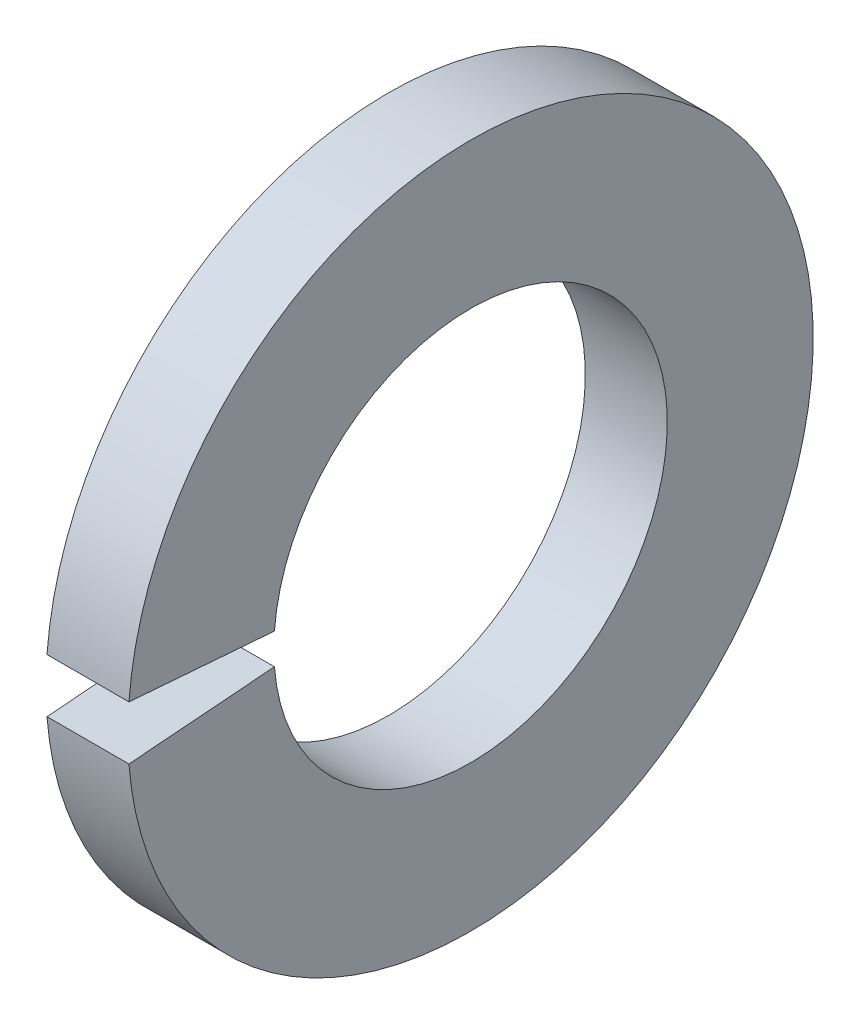
ISO-10303-21;
HEADER;
FILE_DESCRIPTION(('STEP AP214'),'2;1');
FILE_NAME('part.step','',(''),(''),'','','');
FILE_SCHEMA(('AUTOMOTIVE_DESIGN { 1 0 10303 214 1 1 1 1 }'));
ENDSEC;
DATA;
#1=APPLICATION_CONTEXT('core data for automotive mechanical design processes');
#2=APPLICATION_PROTOCOL_DEFINITION('international standard','automotive_design',2000,#1);
#3=PRODUCT_CONTEXT('',#1,'mechanical');
#4=PRODUCT('Part','Part','',(#3));
#5=PRODUCT_RELATED_PRODUCT_CATEGORY('part','',(#4));
#6=PRODUCT_DEFINITION_FORMATION('','',#4);
#7=PRODUCT_DEFINITION_CONTEXT('part definition',#1,'design');
#8=PRODUCT_DEFINITION('design','',#6,#7);
#9=PRODUCT_DEFINITION_SHAPE('','',#8);
#10=(LENGTH_UNIT() NAMED_UNIT(*) SI_UNIT(.MILLI.,.METRE.));
#11=(NAMED_UNIT(*) PLANE_ANGLE_UNIT() SI_UNIT($,.RADIAN.));
#12=(NAMED_UNIT(*) SI_UNIT($,.STERADIAN.) SOLID_ANGLE_UNIT());
#13=UNCERTAINTY_MEASURE_WITH_UNIT(LENGTH_MEASURE(1.E-05),#10,'distance_accuracy_value','');
#14=(GEOMETRIC_REPRESENTATION_CONTEXT(3) GLOBAL_UNCERTAINTY_ASSIGNED_CONTEXT((#13)) GLOBAL_UNIT_ASSIGNED_CONTEXT((#10,
#11,#12)) REPRESENTATION_CONTEXT('',''));
#15=CARTESIAN_POINT('',(0.,0.,0.));
#16=DIRECTION('',(0.,0.,1.));
#17=DIRECTION('',(1.,0.,0.));
#18=AXIS2_PLACEMENT_3D('',#15,#16,#17);
#19=CARTESIAN_POINT('',(-34.9249999999999,0.,0.));
#20=DIRECTION('',(-1.,0.,0.));
#21=DIRECTION('',(0.,0.,1.));
#22=AXIS2_PLACEMENT_3D('',#19,#20,#21);
#23=CYLINDRICAL_SURFACE('',#22,1.524);
#24=CARTESIAN_POINT('',(0.,0.,0.));
#25=DIRECTION('',(-1.,0.,0.));
#26=DIRECTION('',(0.,0.,1.));
#27=AXIS2_PLACEMENT_3D('',#24,#25,#26);
#28=CIRCLE('',#27,1.524);
#29=CARTESIAN_POINT('',(0.,0.119571661889237,1.51930201660929));
#30=VERTEX_POINT('',#29);
#31=CARTESIAN_POINT('',(0.,-0.119571661889237,1.51930201660929));
#32=VERTEX_POINT('',#31);
#33=EDGE_CURVE('E83',#30,#32,#28,.T.);
#34=ORIENTED_EDGE('',*,*,#33,.F.);
#35=DIRECTION('',(-1.,0.,0.));
#36=VECTOR('',#35,1.);
#37=CARTESIAN_POINT('',(-34.9249999999999,0.119571661889237,1.51930201660929));
#38=LINE('',#37,#36);
#39=CARTESIAN_POINT('',(-0.635,0.119571661889237,1.51930201660929));
#40=VERTEX_POINT('',#39);
#41=EDGE_CURVE('E97',#30,#40,#38,.T.);
#42=ORIENTED_EDGE('',*,*,#41,.T.);
#43=CARTESIAN_POINT('',(-0.634999999999997,0.,0.));
#44=DIRECTION('',(-1.,0.,0.));
#45=DIRECTION('',(0.,0.,1.));
#46=AXIS2_PLACEMENT_3D('',#43,#44,#45);
#47=CIRCLE('',#46,1.524);
#48=CARTESIAN_POINT('',(-0.634999999999997,-0.119571661889237,1.51930201660929));
#49=VERTEX_POINT('',#48);
#50=EDGE_CURVE('E85',#40,#49,#47,.T.);
#51=ORIENTED_EDGE('',*,*,#50,.T.);
#52=DIRECTION('',(-1.,0.,0.));
#53=VECTOR('',#52,1.);
#54=CARTESIAN_POINT('',(-34.9249999999999,-0.119571661889237,1.51930201660929));
#55=LINE('',#54,#53);
#56=EDGE_CURVE('E53',#32,#49,#55,.T.);
#57=ORIENTED_EDGE('',*,*,#56,.F.);
#58=EDGE_LOOP('',(#34,#42,#51,#57));
#59=FACE_BOUND('',#58,.T.);
#60=ADVANCED_FACE('F32',(#59),#23,.F.);
#61=CARTESIAN_POINT('',(0.,1.524,0.));
#62=DIRECTION('',(-1.,0.,0.));
#63=DIRECTION('',(0.,0.,1.));
#64=AXIS2_PLACEMENT_3D('',#61,#62,#63);
#65=PLANE('',#64);
#66=CARTESIAN_POINT('',(0.,0.,0.));
#67=DIRECTION('',(-1.,0.,0.));
#68=DIRECTION('',(0.,0.,1.));
#69=AXIS2_PLACEMENT_3D('',#66,#67,#68);
#70=CIRCLE('',#69,2.6543);
#71=CARTESIAN_POINT('',(0.,0.208253977790421,2.64611767892784));
#72=VERTEX_POINT('',#71);
#73=CARTESIAN_POINT('',(0.,-0.208253977790421,2.64611767892784));
#74=VERTEX_POINT('',#73);
#75=EDGE_CURVE('E89',#72,#74,#70,.T.);
#76=ORIENTED_EDGE('',*,*,#75,.F.);
#77=DIRECTION('',(0.,0.0784590957278456,0.996917333733128));
#78=VECTOR('',#77,1.);
#79=CARTESIAN_POINT('',(0.,0.,0.));
#80=LINE('',#79,#78);
#81=EDGE_CURVE('E77',#30,#72,#80,.T.);
#82=ORIENTED_EDGE('',*,*,#81,.F.);
#83=ORIENTED_EDGE('',*,*,#33,.T.);
#84=DIRECTION('',(0.,-0.0784590957278456,0.996917333733128));
#85=VECTOR('',#84,1.);
#86=CARTESIAN_POINT('',(0.,0.,0.));
#87=LINE('',#86,#85);
#88=EDGE_CURVE('E69',#32,#74,#87,.T.);
#89=ORIENTED_EDGE('',*,*,#88,.T.);
#90=EDGE_LOOP('',(#76,#82,#83,#89));
#91=FACE_BOUND('',#90,.T.);
#92=ADVANCED_FACE('F88',(#91),#65,.F.);
#93=CARTESIAN_POINT('',(-34.9249999999999,0.,0.));
#94=DIRECTION('',(-1.,0.,0.));
#95=DIRECTION('',(0.,0.,1.));
#96=AXIS2_PLACEMENT_3D('',#93,#94,#95);
#97=CYLINDRICAL_SURFACE('',#96,2.6543);
#98=CARTESIAN_POINT('',(-0.634999999999997,0.,0.));
#99=DIRECTION('',(-1.,0.,0.));
#100=DIRECTION('',(0.,0.,1.));
#101=AXIS2_PLACEMENT_3D('',#98,#99,#100);
#102=CIRCLE('',#101,2.6543);
#103=CARTESIAN_POINT('',(-0.634999999999997,0.208253977790421,2.64611767892784));
#104=VERTEX_POINT('',#103);
#105=CARTESIAN_POINT('',(-0.635,-0.208253977790421,2.64611767892784));
#106=VERTEX_POINT('',#105);
#107=EDGE_CURVE('E91',#104,#106,#102,.T.);
#108=ORIENTED_EDGE('',*,*,#107,.F.);
#109=DIRECTION('',(-1.,0.,0.));
#110=VECTOR('',#109,1.);
#111=CARTESIAN_POINT('',(-34.9249999999999,0.208253977790421,2.64611767892784));
#112=LINE('',#111,#110);
#113=EDGE_CURVE('E46',#104,#72,#112,.F.);
#114=ORIENTED_EDGE('',*,*,#113,.T.);
#115=ORIENTED_EDGE('',*,*,#75,.T.);
#116=DIRECTION('',(-1.,0.,0.));
#117=VECTOR('',#116,1.);
#118=CARTESIAN_POINT('',(-34.9249999999999,-0.208253977790421,2.64611767892784));
#119=LINE('',#118,#117);
#120=EDGE_CURVE('E72',#106,#74,#119,.F.);
#121=ORIENTED_EDGE('',*,*,#120,.F.);
#122=EDGE_LOOP('',(#108,#114,#115,#121));
#123=FACE_BOUND('',#122,.T.);
#124=ADVANCED_FACE('F104',(#123),#97,.T.);
#125=CARTESIAN_POINT('',(-0.634999999999998,2.6543,0.));
#126=DIRECTION('',(1.,0.,0.));
#127=DIRECTION('',(0.,0.,-1.));
#128=AXIS2_PLACEMENT_3D('',#125,#126,#127);
#129=PLANE('',#128);
#130=ORIENTED_EDGE('',*,*,#50,.F.);
#131=DIRECTION('',(0.,0.0784590957278456,0.996917333733128));
#132=VECTOR('',#131,1.);
#133=CARTESIAN_POINT('',(-0.634999999999998,0.0163394187791635,0.207612000278144));
#134=LINE('',#133,#132);
#135=EDGE_CURVE('E11',#40,#104,#134,.T.);
#136=ORIENTED_EDGE('',*,*,#135,.T.);
#137=ORIENTED_EDGE('',*,*,#107,.T.);
#138=DIRECTION('',(0.,-0.0784590957278456,0.996917333733128));
#139=VECTOR('',#138,1.);
#140=CARTESIAN_POINT('',(-0.634999999999998,0.0163394187791635,-0.207612000278144));
#141=LINE('',#140,#139);
#142=EDGE_CURVE('E39',#49,#106,#141,.T.);
#143=ORIENTED_EDGE('',*,*,#142,.F.);
#144=EDGE_LOOP('',(#130,#136,#137,#143));
#145=FACE_BOUND('',#144,.T.);
#146=ADVANCED_FACE('F106',(#145),#129,.F.);
#147=CARTESIAN_POINT('',(-0.635,0.,0.));
#148=DIRECTION('',(0.,0.996917333733128,0.0784590957278456));
#149=DIRECTION('',(0.,-0.0784590957278456,0.996917333733128));
#150=AXIS2_PLACEMENT_3D('',#147,#148,#149);
#151=PLANE('',#150);
#152=ORIENTED_EDGE('',*,*,#56,.T.);
#153=ORIENTED_EDGE('',*,*,#142,.T.);
#154=ORIENTED_EDGE('',*,*,#120,.T.);
#155=ORIENTED_EDGE('',*,*,#88,.F.);
#156=EDGE_LOOP('',(#152,#153,#154,#155));
#157=FACE_BOUND('',#156,.T.);
#158=ADVANCED_FACE('F70',(#157),#151,.T.);
#159=CARTESIAN_POINT('',(-0.635,0.,0.));
#160=DIRECTION('',(0.,0.996917333733128,-0.0784590957278456));
#161=DIRECTION('',(0.,0.0784590957278456,0.996917333733128));
#162=AXIS2_PLACEMENT_3D('',#159,#160,#161);
#163=PLANE('',#162);
#164=ORIENTED_EDGE('',*,*,#81,.T.);
#165=ORIENTED_EDGE('',*,*,#113,.F.);
#166=ORIENTED_EDGE('',*,*,#135,.F.);
#167=ORIENTED_EDGE('',*,*,#41,.F.);
#168=EDGE_LOOP('',(#164,#165,#166,#167));
#169=FACE_BOUND('',#168,.T.);
#170=ADVANCED_FACE('F101',(#169),#163,.F.);
#171=CLOSED_SHELL('',(#60,#92,#124,#146,#158,#170));
#172=MANIFOLD_SOLID_BREP('B2',#171);
#173=ADVANCED_BREP_SHAPE_REPRESENTATION('',(#18,#172),#14);
#174=SHAPE_DEFINITION_REPRESENTATION(#9,#173);
ENDSEC;
END-ISO-10303-21;
